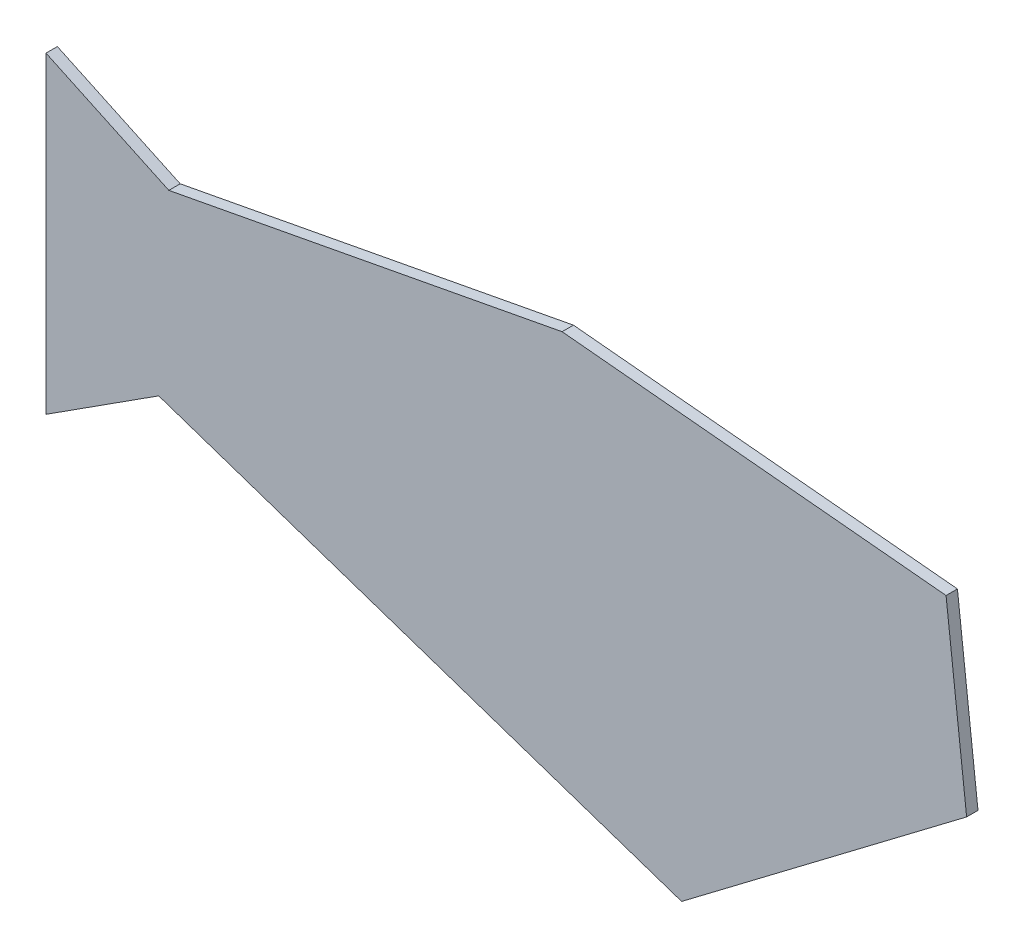
ISO-10303-21;
HEADER;
FILE_DESCRIPTION(('STEP AP214'),'2;1');
FILE_NAME('part.step','',(''),(''),'','','');
FILE_SCHEMA(('AUTOMOTIVE_DESIGN { 1 0 10303 214 1 1 1 1 }'));
ENDSEC;
DATA;
#1=APPLICATION_CONTEXT('core data for automotive mechanical design processes');
#2=APPLICATION_PROTOCOL_DEFINITION('international standard','automotive_design',2000,#1);
#3=PRODUCT_CONTEXT('',#1,'mechanical');
#4=PRODUCT('Part','Part','',(#3));
#5=PRODUCT_RELATED_PRODUCT_CATEGORY('part','',(#4));
#6=PRODUCT_DEFINITION_FORMATION('','',#4);
#7=PRODUCT_DEFINITION_CONTEXT('part definition',#1,'design');
#8=PRODUCT_DEFINITION('design','',#6,#7);
#9=PRODUCT_DEFINITION_SHAPE('','',#8);
#10=(LENGTH_UNIT() NAMED_UNIT(*) SI_UNIT(.MILLI.,.METRE.));
#11=(NAMED_UNIT(*) PLANE_ANGLE_UNIT() SI_UNIT($,.RADIAN.));
#12=(NAMED_UNIT(*) SI_UNIT($,.STERADIAN.) SOLID_ANGLE_UNIT());
#13=UNCERTAINTY_MEASURE_WITH_UNIT(LENGTH_MEASURE(1.E-05),#10,'distance_accuracy_value','');
#14=(GEOMETRIC_REPRESENTATION_CONTEXT(3) GLOBAL_UNCERTAINTY_ASSIGNED_CONTEXT((#13)) GLOBAL_UNIT_ASSIGNED_CONTEXT((#10,
#11,#12)) REPRESENTATION_CONTEXT('',''));
#15=CARTESIAN_POINT('',(0.,0.,0.));
#16=DIRECTION('',(0.,0.,1.));
#17=DIRECTION('',(1.,0.,0.));
#18=AXIS2_PLACEMENT_3D('',#15,#16,#17);
#19=CARTESIAN_POINT('',(-24.0742887411273,7.6015096153047,1.));
#20=DIRECTION('',(-0.423618295534962,-0.905840791578771,0.));
#21=DIRECTION('',(0.905840791578771,-0.423618295534962,0.));
#22=AXIS2_PLACEMENT_3D('',#19,#20,#21);
#23=PLANE('',#22);
#24=DIRECTION('',(-0.905840791578771,0.423618295534962,0.));
#25=VECTOR('',#24,1.);
#26=CARTESIAN_POINT('',(-24.0742887411273,7.6015096153047,0.));
#27=LINE('',#26,#25);
#28=CARTESIAN_POINT('',(-24.0742887411273,7.6015096153047,0.));
#29=VERTEX_POINT('',#28);
#30=CARTESIAN_POINT('',(-34.8778155491618,12.6538009834262,0.));
#31=VERTEX_POINT('',#30);
#32=EDGE_CURVE('E133',#29,#31,#27,.T.);
#33=ORIENTED_EDGE('',*,*,#32,.T.);
#34=DIRECTION('',(0.,0.,-1.));
#35=VECTOR('',#34,1.);
#36=CARTESIAN_POINT('',(-34.8778155491618,12.6538009834262,1.));
#37=LINE('',#36,#35);
#38=CARTESIAN_POINT('',(-34.8778155491618,12.6538009834262,1.));
#39=VERTEX_POINT('',#38);
#40=EDGE_CURVE('E11',#39,#31,#37,.T.);
#41=ORIENTED_EDGE('',*,*,#40,.F.);
#42=DIRECTION('',(-0.905840791578771,0.423618295534962,0.));
#43=VECTOR('',#42,1.);
#44=CARTESIAN_POINT('',(-24.0742887411273,7.6015096153047,1.));
#45=LINE('',#44,#43);
#46=CARTESIAN_POINT('',(-24.0742887411273,7.6015096153047,1.));
#47=VERTEX_POINT('',#46);
#48=EDGE_CURVE('E147',#47,#39,#45,.T.);
#49=ORIENTED_EDGE('',*,*,#48,.F.);
#50=DIRECTION('',(0.,0.,-1.));
#51=VECTOR('',#50,1.);
#52=CARTESIAN_POINT('',(-24.0742887411273,7.6015096153047,1.));
#53=LINE('',#52,#51);
#54=EDGE_CURVE('E129',#47,#29,#53,.T.);
#55=ORIENTED_EDGE('',*,*,#54,.T.);
#56=EDGE_LOOP('',(#33,#41,#49,#55));
#57=FACE_BOUND('',#56,.T.);
#58=ADVANCED_FACE('F37',(#57),#23,.F.);
#59=CARTESIAN_POINT('',(-34.8778155491618,12.6538009834262,1.));
#60=DIRECTION('',(1.,0.,0.));
#61=DIRECTION('',(0.,0.,-1.));
#62=AXIS2_PLACEMENT_3D('',#59,#60,#61);
#63=PLANE('',#62);
#64=DIRECTION('',(0.,-1.,0.));
#65=VECTOR('',#64,1.);
#66=CARTESIAN_POINT('',(-34.8778155491618,12.6538009834262,0.));
#67=LINE('',#66,#65);
#68=CARTESIAN_POINT('',(-34.8778155491618,-14.8583442709725,0.));
#69=VERTEX_POINT('',#68);
#70=EDGE_CURVE('E136',#31,#69,#67,.T.);
#71=ORIENTED_EDGE('',*,*,#70,.T.);
#72=DIRECTION('',(0.,0.,-1.));
#73=VECTOR('',#72,1.);
#74=CARTESIAN_POINT('',(-34.8778155491618,-14.8583442709725,1.));
#75=LINE('',#74,#73);
#76=CARTESIAN_POINT('',(-34.8778155491618,-14.8583442709725,1.));
#77=VERTEX_POINT('',#76);
#78=EDGE_CURVE('E45',#77,#69,#75,.T.);
#79=ORIENTED_EDGE('',*,*,#78,.F.);
#80=DIRECTION('',(0.,-1.,0.));
#81=VECTOR('',#80,1.);
#82=CARTESIAN_POINT('',(-34.8778155491618,12.6538009834262,1.));
#83=LINE('',#82,#81);
#84=EDGE_CURVE('E96',#39,#77,#83,.T.);
#85=ORIENTED_EDGE('',*,*,#84,.F.);
#86=ORIENTED_EDGE('',*,*,#40,.T.);
#87=EDGE_LOOP('',(#71,#79,#85,#86));
#88=FACE_BOUND('',#87,.T.);
#89=ADVANCED_FACE('F182',(#88),#63,.F.);
#90=CARTESIAN_POINT('',(-34.8778155491618,-14.8583442709725,1.));
#91=DIRECTION('',(-0.540122585807694,0.841586354630593,0.));
#92=DIRECTION('',(-0.841586354630593,-0.540122585807694,0.));
#93=AXIS2_PLACEMENT_3D('',#90,#91,#92);
#94=PLANE('',#93);
#95=DIRECTION('',(0.841586354630593,0.540122585807694,0.));
#96=VECTOR('',#95,1.);
#97=CARTESIAN_POINT('',(-34.8778155491618,-14.8583442709725,0.));
#98=LINE('',#97,#96);
#99=CARTESIAN_POINT('',(-24.9632616812709,-8.4952723856097,0.));
#100=VERTEX_POINT('',#99);
#101=EDGE_CURVE('E138',#69,#100,#98,.T.);
#102=ORIENTED_EDGE('',*,*,#101,.T.);
#103=DIRECTION('',(0.,0.,-1.));
#104=VECTOR('',#103,1.);
#105=CARTESIAN_POINT('',(-24.9632616812709,-8.4952723856097,1.));
#106=LINE('',#105,#104);
#107=CARTESIAN_POINT('',(-24.9632616812709,-8.4952723856097,1.));
#108=VERTEX_POINT('',#107);
#109=EDGE_CURVE('E154',#108,#100,#106,.T.);
#110=ORIENTED_EDGE('',*,*,#109,.F.);
#111=DIRECTION('',(0.841586354630593,0.540122585807694,0.));
#112=VECTOR('',#111,1.);
#113=CARTESIAN_POINT('',(-34.8778155491618,-14.8583442709725,1.));
#114=LINE('',#113,#112);
#115=EDGE_CURVE('E162',#77,#108,#114,.T.);
#116=ORIENTED_EDGE('',*,*,#115,.F.);
#117=ORIENTED_EDGE('',*,*,#78,.T.);
#118=EDGE_LOOP('',(#102,#110,#116,#117));
#119=FACE_BOUND('',#118,.T.);
#120=ADVANCED_FACE('F160',(#119),#94,.F.);
#121=CARTESIAN_POINT('',(-24.9632616812709,-8.4952723856097,1.));
#122=DIRECTION('',(0.319650532491241,0.947535507027608,0.));
#123=DIRECTION('',(-0.947535507027608,0.319650532491241,0.));
#124=AXIS2_PLACEMENT_3D('',#121,#122,#123);
#125=PLANE('',#124);
#126=DIRECTION('',(0.947535507027608,-0.319650532491241,0.));
#127=VECTOR('',#126,1.);
#128=CARTESIAN_POINT('',(-24.9632616812709,-8.4952723856097,0.));
#129=LINE('',#128,#127);
#130=CARTESIAN_POINT('',(21.0232261675474,-24.008786358705,0.));
#131=VERTEX_POINT('',#130);
#132=EDGE_CURVE('E140',#100,#131,#129,.T.);
#133=ORIENTED_EDGE('',*,*,#132,.T.);
#134=DIRECTION('',(0.,0.,-1.));
#135=VECTOR('',#134,1.);
#136=CARTESIAN_POINT('',(21.0232261675474,-24.008786358705,1.));
#137=LINE('',#136,#135);
#138=CARTESIAN_POINT('',(21.0232261675474,-24.008786358705,1.));
#139=VERTEX_POINT('',#138);
#140=EDGE_CURVE('E151',#139,#131,#137,.T.);
#141=ORIENTED_EDGE('',*,*,#140,.F.);
#142=DIRECTION('',(0.947535507027608,-0.319650532491241,0.));
#143=VECTOR('',#142,1.);
#144=CARTESIAN_POINT('',(-24.9632616812709,-8.4952723856097,1.));
#145=LINE('',#144,#143);
#146=EDGE_CURVE('E174',#108,#139,#145,.T.);
#147=ORIENTED_EDGE('',*,*,#146,.F.);
#148=ORIENTED_EDGE('',*,*,#109,.T.);
#149=EDGE_LOOP('',(#133,#141,#147,#148));
#150=FACE_BOUND('',#149,.T.);
#151=ADVANCED_FACE('F170',(#150),#125,.F.);
#152=CARTESIAN_POINT('',(21.0232261675474,-24.008786358705,1.));
#153=DIRECTION('',(-0.603442670185536,0.797406385602317,0.));
#154=DIRECTION('',(-0.797406385602317,-0.603442670185536,0.));
#155=AXIS2_PLACEMENT_3D('',#152,#153,#154);
#156=PLANE('',#155);
#157=DIRECTION('',(0.797406385602316,0.603442670185536,0.));
#158=VECTOR('',#157,1.);
#159=CARTESIAN_POINT('',(21.0232261675474,-24.008786358705,0.));
#160=LINE('',#159,#158);
#161=CARTESIAN_POINT('',(46.087102078902,-5.04152891227455,0.));
#162=VERTEX_POINT('',#161);
#163=EDGE_CURVE('E142',#131,#162,#160,.T.);
#164=ORIENTED_EDGE('',*,*,#163,.T.);
#165=DIRECTION('',(0.,0.,-1.));
#166=VECTOR('',#165,1.);
#167=CARTESIAN_POINT('',(46.087102078902,-5.04152891227455,1.));
#168=LINE('',#167,#166);
#169=CARTESIAN_POINT('',(46.087102078902,-5.04152891227455,1.));
#170=VERTEX_POINT('',#169);
#171=EDGE_CURVE('E124',#170,#162,#168,.T.);
#172=ORIENTED_EDGE('',*,*,#171,.F.);
#173=DIRECTION('',(0.797406385602316,0.603442670185536,0.));
#174=VECTOR('',#173,1.);
#175=CARTESIAN_POINT('',(21.0232261675474,-24.008786358705,1.));
#176=LINE('',#175,#174);
#177=EDGE_CURVE('E115',#139,#170,#176,.T.);
#178=ORIENTED_EDGE('',*,*,#177,.F.);
#179=ORIENTED_EDGE('',*,*,#140,.T.);
#180=EDGE_LOOP('',(#164,#172,#178,#179));
#181=FACE_BOUND('',#180,.T.);
#182=ADVANCED_FACE('F173',(#181),#156,.F.);
#183=CARTESIAN_POINT('',(46.087102078902,-5.04152891227455,1.));
#184=DIRECTION('',(-0.993643339101155,-0.112574040790529,0.));
#185=DIRECTION('',(0.112574040790529,-0.993643339101155,0.));
#186=AXIS2_PLACEMENT_3D('',#183,#184,#185);
#187=PLANE('',#186);
#188=DIRECTION('',(-0.112574040790529,0.993643339101155,0.));
#189=VECTOR('',#188,1.);
#190=CARTESIAN_POINT('',(46.087102078902,-5.04152891227455,0.));
#191=LINE('',#190,#189);
#192=CARTESIAN_POINT('',(44.2785341826921,10.921933274581,0.));
#193=VERTEX_POINT('',#192);
#194=EDGE_CURVE('E123',#162,#193,#191,.T.);
#195=ORIENTED_EDGE('',*,*,#194,.T.);
#196=DIRECTION('',(0.,0.,-1.));
#197=VECTOR('',#196,1.);
#198=CARTESIAN_POINT('',(44.2785341826921,10.921933274581,1.));
#199=LINE('',#198,#197);
#200=CARTESIAN_POINT('',(44.2785341826921,10.921933274581,1.));
#201=VERTEX_POINT('',#200);
#202=EDGE_CURVE('E120',#201,#193,#199,.T.);
#203=ORIENTED_EDGE('',*,*,#202,.F.);
#204=DIRECTION('',(-0.112574040790529,0.993643339101155,0.));
#205=VECTOR('',#204,1.);
#206=CARTESIAN_POINT('',(46.087102078902,-5.04152891227455,1.));
#207=LINE('',#206,#205);
#208=EDGE_CURVE('E109',#170,#201,#207,.T.);
#209=ORIENTED_EDGE('',*,*,#208,.F.);
#210=ORIENTED_EDGE('',*,*,#171,.T.);
#211=EDGE_LOOP('',(#195,#203,#209,#210));
#212=FACE_BOUND('',#211,.T.);
#213=ADVANCED_FACE('F121',(#212),#187,.F.);
#214=CARTESIAN_POINT('',(44.2785341826921,10.921933274581,1.));
#215=DIRECTION('',(-0.0945397300605901,-0.995521089399954,0.));
#216=DIRECTION('',(0.995521089399954,-0.0945397300605901,0.));
#217=AXIS2_PLACEMENT_3D('',#214,#215,#216);
#218=PLANE('',#217);
#219=DIRECTION('',(-0.995521089399954,0.0945397300605901,0.));
#220=VECTOR('',#219,1.);
#221=CARTESIAN_POINT('',(44.2785341826921,10.921933274581,0.));
#222=LINE('',#221,#220);
#223=CARTESIAN_POINT('',(10.5079960995586,14.1289547916286,0.));
#224=VERTEX_POINT('',#223);
#225=EDGE_CURVE('E82',#193,#224,#222,.T.);
#226=ORIENTED_EDGE('',*,*,#225,.T.);
#227=DIRECTION('',(0.,0.,-1.));
#228=VECTOR('',#227,1.);
#229=CARTESIAN_POINT('',(10.5079960995586,14.1289547916286,1.));
#230=LINE('',#229,#228);
#231=CARTESIAN_POINT('',(10.5079960995586,14.1289547916286,1.));
#232=VERTEX_POINT('',#231);
#233=EDGE_CURVE('E125',#232,#224,#230,.T.);
#234=ORIENTED_EDGE('',*,*,#233,.F.);
#235=DIRECTION('',(-0.995521089399954,0.0945397300605901,0.));
#236=VECTOR('',#235,1.);
#237=CARTESIAN_POINT('',(44.2785341826921,10.921933274581,1.));
#238=LINE('',#237,#236);
#239=EDGE_CURVE('E113',#201,#232,#238,.T.);
#240=ORIENTED_EDGE('',*,*,#239,.F.);
#241=ORIENTED_EDGE('',*,*,#202,.T.);
#242=EDGE_LOOP('',(#226,#234,#240,#241));
#243=FACE_BOUND('',#242,.T.);
#244=ADVANCED_FACE('F127',(#243),#218,.F.);
#245=CARTESIAN_POINT('',(10.5079960995586,14.1289547916286,1.));
#246=DIRECTION('',(0.185476063406795,-0.982648782578556,0.));
#247=DIRECTION('',(0.982648782578556,0.185476063406795,0.));
#248=AXIS2_PLACEMENT_3D('',#245,#246,#247);
#249=PLANE('',#248);
#250=DIRECTION('',(-0.982648782578556,-0.185476063406795,0.));
#251=VECTOR('',#250,1.);
#252=CARTESIAN_POINT('',(10.5079960995586,14.1289547916286,0.));
#253=LINE('',#252,#251);
#254=EDGE_CURVE('E88',#224,#29,#253,.T.);
#255=ORIENTED_EDGE('',*,*,#254,.T.);
#256=ORIENTED_EDGE('',*,*,#54,.F.);
#257=DIRECTION('',(-0.982648782578556,-0.185476063406795,0.));
#258=VECTOR('',#257,1.);
#259=CARTESIAN_POINT('',(10.5079960995586,14.1289547916286,1.));
#260=LINE('',#259,#258);
#261=EDGE_CURVE('E53',#232,#47,#260,.T.);
#262=ORIENTED_EDGE('',*,*,#261,.F.);
#263=ORIENTED_EDGE('',*,*,#233,.T.);
#264=EDGE_LOOP('',(#255,#256,#262,#263));
#265=FACE_BOUND('',#264,.T.);
#266=ADVANCED_FACE('F198',(#265),#249,.F.);
#267=CARTESIAN_POINT('',(0.,0.,1.));
#268=DIRECTION('',(0.,0.,1.));
#269=DIRECTION('',(1.,0.,0.));
#270=AXIS2_PLACEMENT_3D('',#267,#268,#269);
#271=PLANE('',#270);
#272=ORIENTED_EDGE('',*,*,#48,.T.);
#273=ORIENTED_EDGE('',*,*,#84,.T.);
#274=ORIENTED_EDGE('',*,*,#115,.T.);
#275=ORIENTED_EDGE('',*,*,#146,.T.);
#276=ORIENTED_EDGE('',*,*,#177,.T.);
#277=ORIENTED_EDGE('',*,*,#208,.T.);
#278=ORIENTED_EDGE('',*,*,#239,.T.);
#279=ORIENTED_EDGE('',*,*,#261,.T.);
#280=EDGE_LOOP('',(#272,#273,#274,#275,#276,#277,#278,#279));
#281=FACE_BOUND('',#280,.T.);
#282=ADVANCED_FACE('F111',(#281),#271,.T.);
#283=CARTESIAN_POINT('',(0.,0.,0.));
#284=DIRECTION('',(0.,0.,1.));
#285=DIRECTION('',(1.,0.,0.));
#286=AXIS2_PLACEMENT_3D('',#283,#284,#285);
#287=PLANE('',#286);
#288=ORIENTED_EDGE('',*,*,#32,.F.);
#289=ORIENTED_EDGE('',*,*,#254,.F.);
#290=ORIENTED_EDGE('',*,*,#225,.F.);
#291=ORIENTED_EDGE('',*,*,#194,.F.);
#292=ORIENTED_EDGE('',*,*,#163,.F.);
#293=ORIENTED_EDGE('',*,*,#132,.F.);
#294=ORIENTED_EDGE('',*,*,#101,.F.);
#295=ORIENTED_EDGE('',*,*,#70,.F.);
#296=EDGE_LOOP('',(#288,#289,#290,#291,#292,#293,#294,#295));
#297=FACE_BOUND('',#296,.T.);
#298=ADVANCED_FACE('F166',(#297),#287,.F.);
#299=CLOSED_SHELL('',(#58,#89,#120,#151,#182,#213,#244,#266,#282,#298));
#300=MANIFOLD_SOLID_BREP('B2',#299);
#301=ADVANCED_BREP_SHAPE_REPRESENTATION('',(#18,#300),#14);
#302=SHAPE_DEFINITION_REPRESENTATION(#9,#301);
ENDSEC;
END-ISO-10303-21;
